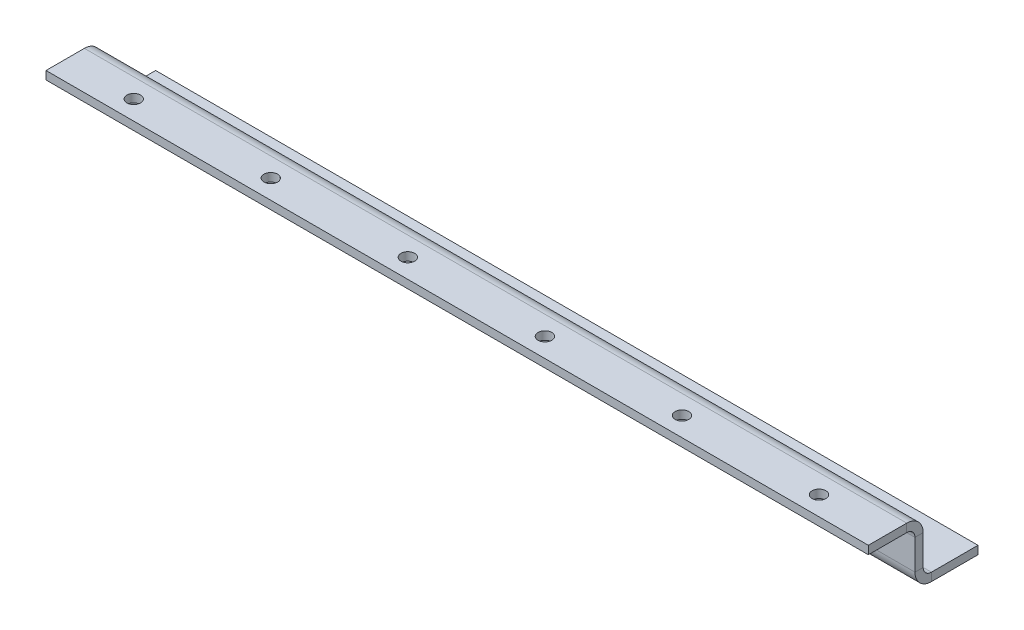
ISO-10303-21;
HEADER;
FILE_DESCRIPTION(('STEP AP214'),'2;1');
FILE_NAME('part.step','',(''),(''),'','','');
FILE_SCHEMA(('AUTOMOTIVE_DESIGN { 1 0 10303 214 1 1 1 1 }'));
ENDSEC;
DATA;
#1=APPLICATION_CONTEXT('core data for automotive mechanical design processes');
#2=APPLICATION_PROTOCOL_DEFINITION('international standard','automotive_design',2000,#1);
#3=PRODUCT_CONTEXT('',#1,'mechanical');
#4=PRODUCT('Part','Part','',(#3));
#5=PRODUCT_RELATED_PRODUCT_CATEGORY('part','',(#4));
#6=PRODUCT_DEFINITION_FORMATION('','',#4);
#7=PRODUCT_DEFINITION_CONTEXT('part definition',#1,'design');
#8=PRODUCT_DEFINITION('design','',#6,#7);
#9=PRODUCT_DEFINITION_SHAPE('','',#8);
#10=(LENGTH_UNIT() NAMED_UNIT(*) SI_UNIT(.MILLI.,.METRE.));
#11=(NAMED_UNIT(*) PLANE_ANGLE_UNIT() SI_UNIT($,.RADIAN.));
#12=(NAMED_UNIT(*) SI_UNIT($,.STERADIAN.) SOLID_ANGLE_UNIT());
#13=UNCERTAINTY_MEASURE_WITH_UNIT(LENGTH_MEASURE(1.E-05),#10,'distance_accuracy_value','');
#14=(GEOMETRIC_REPRESENTATION_CONTEXT(3) GLOBAL_UNCERTAINTY_ASSIGNED_CONTEXT((#13)) GLOBAL_UNIT_ASSIGNED_CONTEXT((#10,
#11,#12)) REPRESENTATION_CONTEXT('',''));
#15=CARTESIAN_POINT('',(0.,0.,0.));
#16=DIRECTION('',(0.,0.,1.));
#17=DIRECTION('',(1.,0.,0.));
#18=AXIS2_PLACEMENT_3D('',#15,#16,#17);
#19=CARTESIAN_POINT('',(300.,4.,0.));
#20=DIRECTION('',(1.,0.,0.));
#21=DIRECTION('',(0.,0.,-1.));
#22=AXIS2_PLACEMENT_3D('',#19,#20,#21);
#23=PLANE('',#22);
#24=DIRECTION('',(0.,0.,1.));
#25=VECTOR('',#24,1.);
#26=CARTESIAN_POINT('',(300.,4.,0.));
#27=LINE('',#26,#25);
#28=CARTESIAN_POINT('',(300.,4.,0.));
#29=VERTEX_POINT('',#28);
#30=CARTESIAN_POINT('',(300.,4.,3.));
#31=VERTEX_POINT('',#30);
#32=EDGE_CURVE('E11',#29,#31,#27,.T.);
#33=ORIENTED_EDGE('',*,*,#32,.F.);
#34=CARTESIAN_POINT('',(300.,4.,6.));
#35=DIRECTION('',(1.,0.,0.));
#36=DIRECTION('',(0.,0.,-1.));
#37=AXIS2_PLACEMENT_3D('',#34,#35,#36);
#38=CIRCLE('',#37,6.);
#39=CARTESIAN_POINT('',(300.,10.,6.));
#40=VERTEX_POINT('',#39);
#41=EDGE_CURVE('E248',#40,#29,#38,.F.);
#42=ORIENTED_EDGE('',*,*,#41,.F.);
#43=DIRECTION('',(0.,1.,0.));
#44=VECTOR('',#43,1.);
#45=CARTESIAN_POINT('',(300.,7.,6.));
#46=LINE('',#45,#44);
#47=CARTESIAN_POINT('',(300.,7.,6.));
#48=VERTEX_POINT('',#47);
#49=EDGE_CURVE('E45',#48,#40,#46,.T.);
#50=ORIENTED_EDGE('',*,*,#49,.F.);
#51=CARTESIAN_POINT('',(300.,4.,6.));
#52=DIRECTION('',(1.,0.,0.));
#53=DIRECTION('',(0.,0.,-1.));
#54=AXIS2_PLACEMENT_3D('',#51,#52,#53);
#55=CIRCLE('',#54,3.);
#56=EDGE_CURVE('E146',#48,#31,#55,.F.);
#57=ORIENTED_EDGE('',*,*,#56,.T.);
#58=EDGE_LOOP('',(#33,#42,#50,#57));
#59=FACE_BOUND('',#58,.T.);
#60=ADVANCED_FACE('F37',(#59),#23,.T.);
#61=CARTESIAN_POINT('',(300.,7.,6.));
#62=DIRECTION('',(1.,0.,0.));
#63=DIRECTION('',(0.,0.,-1.));
#64=AXIS2_PLACEMENT_3D('',#61,#62,#63);
#65=PLANE('',#64);
#66=DIRECTION('',(0.,-1.,0.));
#67=VECTOR('',#66,1.);
#68=CARTESIAN_POINT('',(300.,10.,0.));
#69=LINE('',#68,#67);
#70=CARTESIAN_POINT('',(300.,-7.,0.));
#71=VERTEX_POINT('',#70);
#72=EDGE_CURVE('E140',#29,#71,#69,.T.);
#73=ORIENTED_EDGE('',*,*,#72,.F.);
#74=ORIENTED_EDGE('',*,*,#32,.T.);
#75=DIRECTION('',(0.,1.,0.));
#76=VECTOR('',#75,1.);
#77=CARTESIAN_POINT('',(300.,10.,3.));
#78=LINE('',#77,#76);
#79=CARTESIAN_POINT('',(300.,-7.,3.));
#80=VERTEX_POINT('',#79);
#81=EDGE_CURVE('E137',#31,#80,#78,.F.);
#82=ORIENTED_EDGE('',*,*,#81,.T.);
#83=DIRECTION('',(0.,0.,-1.));
#84=VECTOR('',#83,1.);
#85=CARTESIAN_POINT('',(300.,-7.,3.));
#86=LINE('',#85,#84);
#87=EDGE_CURVE('E229',#80,#71,#86,.T.);
#88=ORIENTED_EDGE('',*,*,#87,.T.);
#89=EDGE_LOOP('',(#73,#74,#82,#88));
#90=FACE_BOUND('',#89,.T.);
#91=ADVANCED_FACE('F135',(#90),#65,.T.);
#92=CARTESIAN_POINT('',(0.,10.,6.));
#93=DIRECTION('',(-1.,0.,0.));
#94=DIRECTION('',(0.,0.,1.));
#95=AXIS2_PLACEMENT_3D('',#92,#93,#94);
#96=PLANE('',#95);
#97=DIRECTION('',(0.,-1.,0.));
#98=VECTOR('',#97,1.);
#99=CARTESIAN_POINT('',(0.,10.,6.));
#100=LINE('',#99,#98);
#101=CARTESIAN_POINT('',(0.,10.,6.));
#102=VERTEX_POINT('',#101);
#103=CARTESIAN_POINT('',(0.,7.,6.));
#104=VERTEX_POINT('',#103);
#105=EDGE_CURVE('E234',#102,#104,#100,.T.);
#106=ORIENTED_EDGE('',*,*,#105,.F.);
#107=CARTESIAN_POINT('',(0.,4.,6.));
#108=DIRECTION('',(1.,0.,0.));
#109=DIRECTION('',(0.,0.,-1.));
#110=AXIS2_PLACEMENT_3D('',#107,#108,#109);
#111=CIRCLE('',#110,6.);
#112=CARTESIAN_POINT('',(0.,4.,0.));
#113=VERTEX_POINT('',#112);
#114=EDGE_CURVE('E186',#102,#113,#111,.F.);
#115=ORIENTED_EDGE('',*,*,#114,.T.);
#116=DIRECTION('',(0.,0.,-1.));
#117=VECTOR('',#116,1.);
#118=CARTESIAN_POINT('',(0.,4.,3.));
#119=LINE('',#118,#117);
#120=CARTESIAN_POINT('',(0.,4.,3.));
#121=VERTEX_POINT('',#120);
#122=EDGE_CURVE('E232',#121,#113,#119,.T.);
#123=ORIENTED_EDGE('',*,*,#122,.F.);
#124=CARTESIAN_POINT('',(0.,4.,6.));
#125=DIRECTION('',(1.,0.,0.));
#126=DIRECTION('',(0.,0.,-1.));
#127=AXIS2_PLACEMENT_3D('',#124,#125,#126);
#128=CIRCLE('',#127,3.);
#129=EDGE_CURVE('E158',#104,#121,#128,.F.);
#130=ORIENTED_EDGE('',*,*,#129,.F.);
#131=EDGE_LOOP('',(#106,#115,#123,#130));
#132=FACE_BOUND('',#131,.T.);
#133=ADVANCED_FACE('F383',(#132),#96,.T.);
#134=CARTESIAN_POINT('',(0.,4.,3.));
#135=DIRECTION('',(-1.,0.,0.));
#136=DIRECTION('',(0.,0.,1.));
#137=AXIS2_PLACEMENT_3D('',#134,#135,#136);
#138=PLANE('',#137);
#139=DIRECTION('',(0.,0.,-1.));
#140=VECTOR('',#139,1.);
#141=CARTESIAN_POINT('',(0.,10.,20.));
#142=LINE('',#141,#140);
#143=CARTESIAN_POINT('',(0.,10.,20.));
#144=VERTEX_POINT('',#143);
#145=EDGE_CURVE('E189',#144,#102,#142,.T.);
#146=ORIENTED_EDGE('',*,*,#145,.T.);
#147=ORIENTED_EDGE('',*,*,#105,.T.);
#148=DIRECTION('',(0.,0.,-1.));
#149=VECTOR('',#148,1.);
#150=CARTESIAN_POINT('',(0.,7.,20.));
#151=LINE('',#150,#149);
#152=CARTESIAN_POINT('',(0.,7.,20.));
#153=VERTEX_POINT('',#152);
#154=EDGE_CURVE('E195',#153,#104,#151,.T.);
#155=ORIENTED_EDGE('',*,*,#154,.F.);
#156=DIRECTION('',(0.,1.,0.));
#157=VECTOR('',#156,1.);
#158=CARTESIAN_POINT('',(0.,7.,20.));
#159=LINE('',#158,#157);
#160=EDGE_CURVE('E192',#153,#144,#159,.T.);
#161=ORIENTED_EDGE('',*,*,#160,.T.);
#162=EDGE_LOOP('',(#146,#147,#155,#161));
#163=FACE_BOUND('',#162,.T.);
#164=ADVANCED_FACE('F386',(#163),#138,.T.);
#165=CARTESIAN_POINT('',(300.,-10.,-3.));
#166=DIRECTION('',(1.,0.,0.));
#167=DIRECTION('',(0.,0.,-1.));
#168=AXIS2_PLACEMENT_3D('',#165,#166,#167);
#169=PLANE('',#168);
#170=DIRECTION('',(0.,-1.,0.));
#171=VECTOR('',#170,1.);
#172=CARTESIAN_POINT('',(300.,-10.,-3.));
#173=LINE('',#172,#171);
#174=CARTESIAN_POINT('',(300.,-10.,-3.));
#175=VERTEX_POINT('',#174);
#176=CARTESIAN_POINT('',(300.,-13.,-3.));
#177=VERTEX_POINT('',#176);
#178=EDGE_CURVE('E53',#175,#177,#173,.T.);
#179=ORIENTED_EDGE('',*,*,#178,.F.);
#180=CARTESIAN_POINT('',(300.,-7.,-3.));
#181=DIRECTION('',(-1.,0.,0.));
#182=DIRECTION('',(0.,0.,1.));
#183=AXIS2_PLACEMENT_3D('',#180,#181,#182);
#184=CIRCLE('',#183,3.);
#185=EDGE_CURVE('E258',#71,#175,#184,.F.);
#186=ORIENTED_EDGE('',*,*,#185,.F.);
#187=ORIENTED_EDGE('',*,*,#87,.F.);
#188=CARTESIAN_POINT('',(300.,-7.,-3.));
#189=DIRECTION('',(1.,0.,0.));
#190=DIRECTION('',(0.,0.,-1.));
#191=AXIS2_PLACEMENT_3D('',#188,#189,#190);
#192=CIRCLE('',#191,6.);
#193=EDGE_CURVE('E166',#80,#177,#192,.T.);
#194=ORIENTED_EDGE('',*,*,#193,.T.);
#195=EDGE_LOOP('',(#179,#186,#187,#194));
#196=FACE_BOUND('',#195,.T.);
#197=ADVANCED_FACE('F378',(#196),#169,.T.);
#198=CARTESIAN_POINT('',(300.,-7.,3.));
#199=DIRECTION('',(1.,0.,0.));
#200=DIRECTION('',(0.,0.,-1.));
#201=AXIS2_PLACEMENT_3D('',#198,#199,#200);
#202=PLANE('',#201);
#203=DIRECTION('',(0.,0.,-1.));
#204=VECTOR('',#203,1.);
#205=CARTESIAN_POINT('',(300.,-10.,0.));
#206=LINE('',#205,#204);
#207=CARTESIAN_POINT('',(300.,-10.,-20.));
#208=VERTEX_POINT('',#207);
#209=EDGE_CURVE('E261',#175,#208,#206,.T.);
#210=ORIENTED_EDGE('',*,*,#209,.F.);
#211=ORIENTED_EDGE('',*,*,#178,.T.);
#212=DIRECTION('',(0.,0.,-1.));
#213=VECTOR('',#212,1.);
#214=CARTESIAN_POINT('',(300.,-13.,0.));
#215=LINE('',#214,#213);
#216=CARTESIAN_POINT('',(300.,-13.,-20.));
#217=VERTEX_POINT('',#216);
#218=EDGE_CURVE('E107',#177,#217,#215,.T.);
#219=ORIENTED_EDGE('',*,*,#218,.T.);
#220=DIRECTION('',(0.,-1.,0.));
#221=VECTOR('',#220,1.);
#222=CARTESIAN_POINT('',(300.,-10.,-20.));
#223=LINE('',#222,#221);
#224=EDGE_CURVE('E264',#208,#217,#223,.T.);
#225=ORIENTED_EDGE('',*,*,#224,.F.);
#226=EDGE_LOOP('',(#210,#211,#219,#225));
#227=FACE_BOUND('',#226,.T.);
#228=ADVANCED_FACE('F369',(#227),#202,.T.);
#229=CARTESIAN_POINT('',(0.,-7.,0.));
#230=DIRECTION('',(-1.,0.,0.));
#231=DIRECTION('',(0.,0.,1.));
#232=AXIS2_PLACEMENT_3D('',#229,#230,#231);
#233=PLANE('',#232);
#234=DIRECTION('',(0.,0.,1.));
#235=VECTOR('',#234,1.);
#236=CARTESIAN_POINT('',(0.,-7.,0.));
#237=LINE('',#236,#235);
#238=CARTESIAN_POINT('',(0.,-7.,0.));
#239=VERTEX_POINT('',#238);
#240=CARTESIAN_POINT('',(0.,-7.,3.));
#241=VERTEX_POINT('',#240);
#242=EDGE_CURVE('E94',#239,#241,#237,.T.);
#243=ORIENTED_EDGE('',*,*,#242,.F.);
#244=CARTESIAN_POINT('',(0.,-7.,-3.));
#245=DIRECTION('',(-1.,0.,0.));
#246=DIRECTION('',(0.,0.,1.));
#247=AXIS2_PLACEMENT_3D('',#244,#245,#246);
#248=CIRCLE('',#247,3.);
#249=CARTESIAN_POINT('',(0.,-10.,-3.));
#250=VERTEX_POINT('',#249);
#251=EDGE_CURVE('E182',#239,#250,#248,.F.);
#252=ORIENTED_EDGE('',*,*,#251,.T.);
#253=DIRECTION('',(0.,1.,0.));
#254=VECTOR('',#253,1.);
#255=CARTESIAN_POINT('',(0.,-13.,-3.));
#256=LINE('',#255,#254);
#257=CARTESIAN_POINT('',(0.,-13.,-3.));
#258=VERTEX_POINT('',#257);
#259=EDGE_CURVE('E101',#258,#250,#256,.T.);
#260=ORIENTED_EDGE('',*,*,#259,.F.);
#261=CARTESIAN_POINT('',(0.,-7.,-3.));
#262=DIRECTION('',(1.,0.,0.));
#263=DIRECTION('',(0.,0.,-1.));
#264=AXIS2_PLACEMENT_3D('',#261,#262,#263);
#265=CIRCLE('',#264,6.);
#266=EDGE_CURVE('E201',#241,#258,#265,.T.);
#267=ORIENTED_EDGE('',*,*,#266,.F.);
#268=EDGE_LOOP('',(#243,#252,#260,#267));
#269=FACE_BOUND('',#268,.T.);
#270=ADVANCED_FACE('F417',(#269),#233,.T.);
#271=CARTESIAN_POINT('',(0.,-13.,-3.));
#272=DIRECTION('',(-1.,0.,0.));
#273=DIRECTION('',(0.,0.,1.));
#274=AXIS2_PLACEMENT_3D('',#271,#272,#273);
#275=PLANE('',#274);
#276=DIRECTION('',(0.,-1.,0.));
#277=VECTOR('',#276,1.);
#278=CARTESIAN_POINT('',(0.,10.,0.));
#279=LINE('',#278,#277);
#280=EDGE_CURVE('E184',#113,#239,#279,.T.);
#281=ORIENTED_EDGE('',*,*,#280,.T.);
#282=ORIENTED_EDGE('',*,*,#242,.T.);
#283=DIRECTION('',(0.,1.,0.));
#284=VECTOR('',#283,1.);
#285=CARTESIAN_POINT('',(0.,10.,3.));
#286=LINE('',#285,#284);
#287=EDGE_CURVE('E199',#121,#241,#286,.F.);
#288=ORIENTED_EDGE('',*,*,#287,.F.);
#289=ORIENTED_EDGE('',*,*,#122,.T.);
#290=EDGE_LOOP('',(#281,#282,#288,#289));
#291=FACE_BOUND('',#290,.T.);
#292=ADVANCED_FACE('F355',(#291),#275,.T.);
#293=CARTESIAN_POINT('',(300.,-13.,0.));
#294=DIRECTION('',(0.,1.,0.));
#295=DIRECTION('',(0.,0.,1.));
#296=AXIS2_PLACEMENT_3D('',#293,#294,#295);
#297=PLANE('',#296);
#298=CARTESIAN_POINT('',(74.9999999999999,-13.,-11.5));
#299=DIRECTION('',(0.,1.,0.));
#300=DIRECTION('',(0.,0.,1.));
#301=AXIS2_PLACEMENT_3D('',#298,#299,#300);
#302=CIRCLE('',#301,2.5);
#303=CARTESIAN_POINT('',(74.9999999999999,-13.,-9.00000000000001));
#304=VERTEX_POINT('',#303);
#305=EDGE_CURVE('E298',#304,#304,#302,.F.);
#306=ORIENTED_EDGE('',*,*,#305,.F.);
#307=EDGE_LOOP('',(#306));
#308=FACE_BOUND('',#307,.T.);
#309=CARTESIAN_POINT('',(125.,-13.,-11.5));
#310=DIRECTION('',(0.,1.,0.));
#311=DIRECTION('',(0.,0.,1.));
#312=AXIS2_PLACEMENT_3D('',#309,#310,#311);
#313=CIRCLE('',#312,2.5);
#314=CARTESIAN_POINT('',(125.,-13.,-9.00000000000001));
#315=VERTEX_POINT('',#314);
#316=EDGE_CURVE('E305',#315,#315,#313,.F.);
#317=ORIENTED_EDGE('',*,*,#316,.F.);
#318=EDGE_LOOP('',(#317));
#319=FACE_BOUND('',#318,.T.);
#320=CARTESIAN_POINT('',(175.,-13.,-11.5));
#321=DIRECTION('',(0.,1.,0.));
#322=DIRECTION('',(0.,0.,1.));
#323=AXIS2_PLACEMENT_3D('',#320,#321,#322);
#324=CIRCLE('',#323,2.50000000000002);
#325=CARTESIAN_POINT('',(175.,-13.,-8.99999999999998));
#326=VERTEX_POINT('',#325);
#327=EDGE_CURVE('E310',#326,#326,#324,.F.);
#328=ORIENTED_EDGE('',*,*,#327,.F.);
#329=EDGE_LOOP('',(#328));
#330=FACE_BOUND('',#329,.T.);
#331=CARTESIAN_POINT('',(225.,-13.,-11.5));
#332=DIRECTION('',(0.,1.,0.));
#333=DIRECTION('',(0.,0.,1.));
#334=AXIS2_PLACEMENT_3D('',#331,#332,#333);
#335=CIRCLE('',#334,2.50000000000002);
#336=CARTESIAN_POINT('',(225.,-13.,-8.99999999999998));
#337=VERTEX_POINT('',#336);
#338=EDGE_CURVE('E317',#337,#337,#335,.F.);
#339=ORIENTED_EDGE('',*,*,#338,.F.);
#340=EDGE_LOOP('',(#339));
#341=FACE_BOUND('',#340,.T.);
#342=CARTESIAN_POINT('',(275.,-13.,-11.5));
#343=DIRECTION('',(0.,1.,0.));
#344=DIRECTION('',(0.,0.,1.));
#345=AXIS2_PLACEMENT_3D('',#342,#343,#344);
#346=CIRCLE('',#345,2.50000000000002);
#347=CARTESIAN_POINT('',(275.,-13.,-8.99999999999998));
#348=VERTEX_POINT('',#347);
#349=EDGE_CURVE('E329',#348,#348,#346,.F.);
#350=ORIENTED_EDGE('',*,*,#349,.F.);
#351=EDGE_LOOP('',(#350));
#352=FACE_BOUND('',#351,.T.);
#353=CARTESIAN_POINT('',(24.9999999999999,-13.,-11.5));
#354=DIRECTION('',(0.,1.,0.));
#355=DIRECTION('',(0.,0.,1.));
#356=AXIS2_PLACEMENT_3D('',#353,#354,#355);
#357=CIRCLE('',#356,2.5);
#358=CARTESIAN_POINT('',(24.9999999999999,-13.,-9.00000000000001));
#359=VERTEX_POINT('',#358);
#360=EDGE_CURVE('E322',#359,#359,#357,.F.);
#361=ORIENTED_EDGE('',*,*,#360,.F.);
#362=EDGE_LOOP('',(#361));
#363=FACE_BOUND('',#362,.T.);
#364=DIRECTION('',(0.,0.,-1.));
#365=VECTOR('',#364,1.);
#366=CARTESIAN_POINT('',(0.,-13.,0.));
#367=LINE('',#366,#365);
#368=CARTESIAN_POINT('',(0.,-13.,-20.));
#369=VERTEX_POINT('',#368);
#370=EDGE_CURVE('E172',#258,#369,#367,.T.);
#371=ORIENTED_EDGE('',*,*,#370,.T.);
#372=DIRECTION('',(-1.,0.,0.));
#373=VECTOR('',#372,1.);
#374=CARTESIAN_POINT('',(300.,-13.,-20.));
#375=LINE('',#374,#373);
#376=EDGE_CURVE('E225',#217,#369,#375,.T.);
#377=ORIENTED_EDGE('',*,*,#376,.F.);
#378=ORIENTED_EDGE('',*,*,#218,.F.);
#379=DIRECTION('',(-1.,0.,0.));
#380=VECTOR('',#379,1.);
#381=CARTESIAN_POINT('',(300.,-13.,-3.));
#382=LINE('',#381,#380);
#383=EDGE_CURVE('E168',#177,#258,#382,.T.);
#384=ORIENTED_EDGE('',*,*,#383,.T.);
#385=EDGE_LOOP('',(#371,#377,#378,#384));
#386=FACE_BOUND('',#385,.T.);
#387=ADVANCED_FACE('F351',(#308,#319,#330,#341,#352,#363,#386),#297,.F.);
#388=CARTESIAN_POINT('',(300.,-10.,-20.));
#389=DIRECTION('',(0.,0.,-1.));
#390=DIRECTION('',(-1.,0.,0.));
#391=AXIS2_PLACEMENT_3D('',#388,#389,#390);
#392=PLANE('',#391);
#393=DIRECTION('',(0.,-1.,0.));
#394=VECTOR('',#393,1.);
#395=CARTESIAN_POINT('',(0.,-10.,-20.));
#396=LINE('',#395,#394);
#397=CARTESIAN_POINT('',(0.,-10.,-20.));
#398=VERTEX_POINT('',#397);
#399=EDGE_CURVE('E175',#398,#369,#396,.T.);
#400=ORIENTED_EDGE('',*,*,#399,.F.);
#401=DIRECTION('',(-1.,0.,0.));
#402=VECTOR('',#401,1.);
#403=CARTESIAN_POINT('',(300.,-10.,-20.));
#404=LINE('',#403,#402);
#405=EDGE_CURVE('E223',#208,#398,#404,.T.);
#406=ORIENTED_EDGE('',*,*,#405,.F.);
#407=ORIENTED_EDGE('',*,*,#224,.T.);
#408=ORIENTED_EDGE('',*,*,#376,.T.);
#409=EDGE_LOOP('',(#400,#406,#407,#408));
#410=FACE_BOUND('',#409,.T.);
#411=ADVANCED_FACE('F354',(#410),#392,.T.);
#412=CARTESIAN_POINT('',(300.,-10.,0.));
#413=DIRECTION('',(0.,1.,0.));
#414=DIRECTION('',(0.,0.,1.));
#415=AXIS2_PLACEMENT_3D('',#412,#413,#414);
#416=PLANE('',#415);
#417=CARTESIAN_POINT('',(74.9999999999999,-10.,-11.5));
#418=DIRECTION('',(0.,1.,0.));
#419=DIRECTION('',(0.,0.,1.));
#420=AXIS2_PLACEMENT_3D('',#417,#418,#419);
#421=CIRCLE('',#420,2.5);
#422=CARTESIAN_POINT('',(74.9999999999999,-10.,-9.00000000000001));
#423=VERTEX_POINT('',#422);
#424=EDGE_CURVE('E302',#423,#423,#421,.F.);
#425=ORIENTED_EDGE('',*,*,#424,.T.);
#426=EDGE_LOOP('',(#425));
#427=FACE_BOUND('',#426,.T.);
#428=CARTESIAN_POINT('',(125.,-10.,-11.5));
#429=DIRECTION('',(0.,1.,0.));
#430=DIRECTION('',(0.,0.,1.));
#431=AXIS2_PLACEMENT_3D('',#428,#429,#430);
#432=CIRCLE('',#431,2.5);
#433=CARTESIAN_POINT('',(125.,-10.,-9.00000000000001));
#434=VERTEX_POINT('',#433);
#435=EDGE_CURVE('E313',#434,#434,#432,.F.);
#436=ORIENTED_EDGE('',*,*,#435,.T.);
#437=EDGE_LOOP('',(#436));
#438=FACE_BOUND('',#437,.T.);
#439=CARTESIAN_POINT('',(175.,-10.,-11.5));
#440=DIRECTION('',(0.,1.,0.));
#441=DIRECTION('',(0.,0.,1.));
#442=AXIS2_PLACEMENT_3D('',#439,#440,#441);
#443=CIRCLE('',#442,2.50000000000002);
#444=CARTESIAN_POINT('',(175.,-10.,-8.99999999999998));
#445=VERTEX_POINT('',#444);
#446=EDGE_CURVE('E314',#445,#445,#443,.F.);
#447=ORIENTED_EDGE('',*,*,#446,.T.);
#448=EDGE_LOOP('',(#447));
#449=FACE_BOUND('',#448,.T.);
#450=CARTESIAN_POINT('',(225.,-10.,-11.5));
#451=DIRECTION('',(0.,1.,0.));
#452=DIRECTION('',(0.,0.,1.));
#453=AXIS2_PLACEMENT_3D('',#450,#451,#452);
#454=CIRCLE('',#453,2.50000000000002);
#455=CARTESIAN_POINT('',(225.,-10.,-8.99999999999998));
#456=VERTEX_POINT('',#455);
#457=EDGE_CURVE('E332',#456,#456,#454,.F.);
#458=ORIENTED_EDGE('',*,*,#457,.T.);
#459=EDGE_LOOP('',(#458));
#460=FACE_BOUND('',#459,.T.);
#461=CARTESIAN_POINT('',(275.,-10.,-11.5));
#462=DIRECTION('',(0.,1.,0.));
#463=DIRECTION('',(0.,0.,1.));
#464=AXIS2_PLACEMENT_3D('',#461,#462,#463);
#465=CIRCLE('',#464,2.50000000000002);
#466=CARTESIAN_POINT('',(275.,-10.,-8.99999999999998));
#467=VERTEX_POINT('',#466);
#468=EDGE_CURVE('E325',#467,#467,#465,.F.);
#469=ORIENTED_EDGE('',*,*,#468,.T.);
#470=EDGE_LOOP('',(#469));
#471=FACE_BOUND('',#470,.T.);
#472=CARTESIAN_POINT('',(24.9999999999999,-10.,-11.5));
#473=DIRECTION('',(0.,1.,0.));
#474=DIRECTION('',(0.,0.,1.));
#475=AXIS2_PLACEMENT_3D('',#472,#473,#474);
#476=CIRCLE('',#475,2.5);
#477=CARTESIAN_POINT('',(24.9999999999999,-10.,-9.00000000000001));
#478=VERTEX_POINT('',#477);
#479=EDGE_CURVE('E326',#478,#478,#476,.F.);
#480=ORIENTED_EDGE('',*,*,#479,.T.);
#481=EDGE_LOOP('',(#480));
#482=FACE_BOUND('',#481,.T.);
#483=DIRECTION('',(0.,0.,-1.));
#484=VECTOR('',#483,1.);
#485=CARTESIAN_POINT('',(0.,-10.,0.));
#486=LINE('',#485,#484);
#487=EDGE_CURVE('E179',#250,#398,#486,.T.);
#488=ORIENTED_EDGE('',*,*,#487,.F.);
#489=DIRECTION('',(-1.,0.,0.));
#490=VECTOR('',#489,1.);
#491=CARTESIAN_POINT('',(300.,-10.,-3.));
#492=LINE('',#491,#490);
#493=EDGE_CURVE('E220',#175,#250,#492,.T.);
#494=ORIENTED_EDGE('',*,*,#493,.F.);
#495=ORIENTED_EDGE('',*,*,#209,.T.);
#496=ORIENTED_EDGE('',*,*,#405,.T.);
#497=EDGE_LOOP('',(#488,#494,#495,#496));
#498=FACE_BOUND('',#497,.T.);
#499=ADVANCED_FACE('F340',(#427,#438,#449,#460,#471,#482,#498),#416,.T.);
#500=CARTESIAN_POINT('',(300.,-7.,-3.));
#501=DIRECTION('',(-1.,0.,0.));
#502=DIRECTION('',(0.,0.,1.));
#503=AXIS2_PLACEMENT_3D('',#500,#501,#502);
#504=CYLINDRICAL_SURFACE('',#503,3.);
#505=ORIENTED_EDGE('',*,*,#251,.F.);
#506=DIRECTION('',(-1.,0.,0.));
#507=VECTOR('',#506,1.);
#508=CARTESIAN_POINT('',(300.,-7.,0.));
#509=LINE('',#508,#507);
#510=EDGE_CURVE('E217',#71,#239,#509,.T.);
#511=ORIENTED_EDGE('',*,*,#510,.F.);
#512=ORIENTED_EDGE('',*,*,#185,.T.);
#513=ORIENTED_EDGE('',*,*,#493,.T.);
#514=EDGE_LOOP('',(#505,#511,#512,#513));
#515=FACE_BOUND('',#514,.T.);
#516=ADVANCED_FACE('F374',(#515),#504,.F.);
#517=CARTESIAN_POINT('',(300.,10.,0.));
#518=DIRECTION('',(0.,0.,-1.));
#519=DIRECTION('',(-1.,0.,0.));
#520=AXIS2_PLACEMENT_3D('',#517,#518,#519);
#521=PLANE('',#520);
#522=ORIENTED_EDGE('',*,*,#280,.F.);
#523=DIRECTION('',(-1.,0.,0.));
#524=VECTOR('',#523,1.);
#525=CARTESIAN_POINT('',(300.,4.,0.));
#526=LINE('',#525,#524);
#527=EDGE_CURVE('E214',#29,#113,#526,.T.);
#528=ORIENTED_EDGE('',*,*,#527,.F.);
#529=ORIENTED_EDGE('',*,*,#72,.T.);
#530=ORIENTED_EDGE('',*,*,#510,.T.);
#531=EDGE_LOOP('',(#522,#528,#529,#530));
#532=FACE_BOUND('',#531,.T.);
#533=ADVANCED_FACE('F381',(#532),#521,.T.);
#534=CARTESIAN_POINT('',(300.,4.,6.));
#535=DIRECTION('',(-1.,0.,0.));
#536=DIRECTION('',(0.,0.,1.));
#537=AXIS2_PLACEMENT_3D('',#534,#535,#536);
#538=CYLINDRICAL_SURFACE('',#537,6.);
#539=ORIENTED_EDGE('',*,*,#114,.F.);
#540=DIRECTION('',(-1.,0.,0.));
#541=VECTOR('',#540,1.);
#542=CARTESIAN_POINT('',(300.,10.,6.));
#543=LINE('',#542,#541);
#544=EDGE_CURVE('E211',#40,#102,#543,.T.);
#545=ORIENTED_EDGE('',*,*,#544,.F.);
#546=ORIENTED_EDGE('',*,*,#41,.T.);
#547=ORIENTED_EDGE('',*,*,#527,.T.);
#548=EDGE_LOOP('',(#539,#545,#546,#547));
#549=FACE_BOUND('',#548,.T.);
#550=ADVANCED_FACE('F247',(#549),#538,.T.);
#551=CARTESIAN_POINT('',(300.,10.,20.));
#552=DIRECTION('',(0.,1.,0.));
#553=DIRECTION('',(0.,0.,1.));
#554=AXIS2_PLACEMENT_3D('',#551,#552,#553);
#555=PLANE('',#554);
#556=CARTESIAN_POINT('',(275.,10.,13.));
#557=DIRECTION('',(0.,1.,0.));
#558=DIRECTION('',(0.,0.,1.));
#559=AXIS2_PLACEMENT_3D('',#556,#557,#558);
#560=CIRCLE('',#559,2.49999999999996);
#561=CARTESIAN_POINT('',(275.,10.,15.5));
#562=VERTEX_POINT('',#561);
#563=EDGE_CURVE('E301',#562,#562,#560,.T.);
#564=ORIENTED_EDGE('',*,*,#563,.F.);
#565=EDGE_LOOP('',(#564));
#566=FACE_BOUND('',#565,.T.);
#567=CARTESIAN_POINT('',(225.,10.,13.));
#568=DIRECTION('',(0.,1.,0.));
#569=DIRECTION('',(0.,0.,1.));
#570=AXIS2_PLACEMENT_3D('',#567,#568,#569);
#571=CIRCLE('',#570,2.5);
#572=CARTESIAN_POINT('',(225.,10.,15.5));
#573=VERTEX_POINT('',#572);
#574=EDGE_CURVE('E278',#573,#573,#571,.T.);
#575=ORIENTED_EDGE('',*,*,#574,.F.);
#576=EDGE_LOOP('',(#575));
#577=FACE_BOUND('',#576,.T.);
#578=CARTESIAN_POINT('',(175.,10.,13.));
#579=DIRECTION('',(0.,1.,0.));
#580=DIRECTION('',(0.,0.,1.));
#581=AXIS2_PLACEMENT_3D('',#578,#579,#580);
#582=CIRCLE('',#581,2.5);
#583=CARTESIAN_POINT('',(175.,10.,15.5));
#584=VERTEX_POINT('',#583);
#585=EDGE_CURVE('E277',#584,#584,#582,.T.);
#586=ORIENTED_EDGE('',*,*,#585,.F.);
#587=EDGE_LOOP('',(#586));
#588=FACE_BOUND('',#587,.T.);
#589=CARTESIAN_POINT('',(125.,10.,13.));
#590=DIRECTION('',(0.,1.,0.));
#591=DIRECTION('',(0.,0.,1.));
#592=AXIS2_PLACEMENT_3D('',#589,#590,#591);
#593=CIRCLE('',#592,2.5);
#594=CARTESIAN_POINT('',(125.,10.,15.5));
#595=VERTEX_POINT('',#594);
#596=EDGE_CURVE('E285',#595,#595,#593,.T.);
#597=ORIENTED_EDGE('',*,*,#596,.F.);
#598=EDGE_LOOP('',(#597));
#599=FACE_BOUND('',#598,.T.);
#600=CARTESIAN_POINT('',(75.,10.,13.));
#601=DIRECTION('',(0.,1.,0.));
#602=DIRECTION('',(0.,0.,1.));
#603=AXIS2_PLACEMENT_3D('',#600,#601,#602);
#604=CIRCLE('',#603,2.5);
#605=CARTESIAN_POINT('',(75.,10.,15.5));
#606=VERTEX_POINT('',#605);
#607=EDGE_CURVE('E291',#606,#606,#604,.T.);
#608=ORIENTED_EDGE('',*,*,#607,.F.);
#609=EDGE_LOOP('',(#608));
#610=FACE_BOUND('',#609,.T.);
#611=CARTESIAN_POINT('',(25.,10.,13.));
#612=DIRECTION('',(0.,1.,0.));
#613=DIRECTION('',(0.,0.,1.));
#614=AXIS2_PLACEMENT_3D('',#611,#612,#613);
#615=CIRCLE('',#614,2.5);
#616=CARTESIAN_POINT('',(25.,10.,15.5));
#617=VERTEX_POINT('',#616);
#618=EDGE_CURVE('E270',#617,#617,#615,.T.);
#619=ORIENTED_EDGE('',*,*,#618,.F.);
#620=EDGE_LOOP('',(#619));
#621=FACE_BOUND('',#620,.T.);
#622=ORIENTED_EDGE('',*,*,#145,.F.);
#623=DIRECTION('',(-1.,0.,0.));
#624=VECTOR('',#623,1.);
#625=CARTESIAN_POINT('',(300.,10.,20.));
#626=LINE('',#625,#624);
#627=CARTESIAN_POINT('',(300.,10.,20.));
#628=VERTEX_POINT('',#627);
#629=EDGE_CURVE('E209',#628,#144,#626,.T.);
#630=ORIENTED_EDGE('',*,*,#629,.F.);
#631=DIRECTION('',(0.,0.,-1.));
#632=VECTOR('',#631,1.);
#633=CARTESIAN_POINT('',(300.,10.,20.));
#634=LINE('',#633,#632);
#635=EDGE_CURVE('E241',#628,#40,#634,.T.);
#636=ORIENTED_EDGE('',*,*,#635,.T.);
#637=ORIENTED_EDGE('',*,*,#544,.T.);
#638=EDGE_LOOP('',(#622,#630,#636,#637));
#639=FACE_BOUND('',#638,.T.);
#640=ADVANCED_FACE('F252',(#566,#577,#588,#599,#610,#621,#639),#555,.T.);
#641=CARTESIAN_POINT('',(300.,7.,20.));
#642=DIRECTION('',(0.,0.,1.));
#643=DIRECTION('',(1.,0.,0.));
#644=AXIS2_PLACEMENT_3D('',#641,#642,#643);
#645=PLANE('',#644);
#646=ORIENTED_EDGE('',*,*,#160,.F.);
#647=DIRECTION('',(-1.,0.,0.));
#648=VECTOR('',#647,1.);
#649=CARTESIAN_POINT('',(300.,7.,20.));
#650=LINE('',#649,#648);
#651=CARTESIAN_POINT('',(300.,7.,20.));
#652=VERTEX_POINT('',#651);
#653=EDGE_CURVE('E207',#652,#153,#650,.T.);
#654=ORIENTED_EDGE('',*,*,#653,.F.);
#655=DIRECTION('',(0.,1.,0.));
#656=VECTOR('',#655,1.);
#657=CARTESIAN_POINT('',(300.,7.,20.));
#658=LINE('',#657,#656);
#659=EDGE_CURVE('E253',#652,#628,#658,.T.);
#660=ORIENTED_EDGE('',*,*,#659,.T.);
#661=ORIENTED_EDGE('',*,*,#629,.T.);
#662=EDGE_LOOP('',(#646,#654,#660,#661));
#663=FACE_BOUND('',#662,.T.);
#664=ADVANCED_FACE('F391',(#663),#645,.T.);
#665=CARTESIAN_POINT('',(300.,7.,20.));
#666=DIRECTION('',(0.,1.,0.));
#667=DIRECTION('',(0.,0.,1.));
#668=AXIS2_PLACEMENT_3D('',#665,#666,#667);
#669=PLANE('',#668);
#670=CARTESIAN_POINT('',(275.,7.,13.));
#671=DIRECTION('',(0.,1.,0.));
#672=DIRECTION('',(0.,0.,1.));
#673=AXIS2_PLACEMENT_3D('',#670,#671,#672);
#674=CIRCLE('',#673,2.49999999999996);
#675=CARTESIAN_POINT('',(275.,7.,15.5));
#676=VERTEX_POINT('',#675);
#677=EDGE_CURVE('E281',#676,#676,#674,.F.);
#678=ORIENTED_EDGE('',*,*,#677,.F.);
#679=EDGE_LOOP('',(#678));
#680=FACE_BOUND('',#679,.T.);
#681=CARTESIAN_POINT('',(225.,7.,13.));
#682=DIRECTION('',(0.,1.,0.));
#683=DIRECTION('',(0.,0.,1.));
#684=AXIS2_PLACEMENT_3D('',#681,#682,#683);
#685=CIRCLE('',#684,2.5);
#686=CARTESIAN_POINT('',(225.,7.,15.5));
#687=VERTEX_POINT('',#686);
#688=EDGE_CURVE('E274',#687,#687,#685,.F.);
#689=ORIENTED_EDGE('',*,*,#688,.F.);
#690=EDGE_LOOP('',(#689));
#691=FACE_BOUND('',#690,.T.);
#692=CARTESIAN_POINT('',(175.,7.,13.));
#693=DIRECTION('',(0.,1.,0.));
#694=DIRECTION('',(0.,0.,1.));
#695=AXIS2_PLACEMENT_3D('',#692,#693,#694);
#696=CIRCLE('',#695,2.5);
#697=CARTESIAN_POINT('',(175.,7.,15.5));
#698=VERTEX_POINT('',#697);
#699=EDGE_CURVE('E282',#698,#698,#696,.F.);
#700=ORIENTED_EDGE('',*,*,#699,.F.);
#701=EDGE_LOOP('',(#700));
#702=FACE_BOUND('',#701,.T.);
#703=CARTESIAN_POINT('',(125.,7.,13.));
#704=DIRECTION('',(0.,1.,0.));
#705=DIRECTION('',(0.,0.,1.));
#706=AXIS2_PLACEMENT_3D('',#703,#704,#705);
#707=CIRCLE('',#706,2.5);
#708=CARTESIAN_POINT('',(125.,7.,15.5));
#709=VERTEX_POINT('',#708);
#710=EDGE_CURVE('E288',#709,#709,#707,.F.);
#711=ORIENTED_EDGE('',*,*,#710,.F.);
#712=EDGE_LOOP('',(#711));
#713=FACE_BOUND('',#712,.T.);
#714=CARTESIAN_POINT('',(75.,7.,13.));
#715=DIRECTION('',(0.,1.,0.));
#716=DIRECTION('',(0.,0.,1.));
#717=AXIS2_PLACEMENT_3D('',#714,#715,#716);
#718=CIRCLE('',#717,2.5);
#719=CARTESIAN_POINT('',(75.,7.,15.5));
#720=VERTEX_POINT('',#719);
#721=EDGE_CURVE('E273',#720,#720,#718,.F.);
#722=ORIENTED_EDGE('',*,*,#721,.F.);
#723=EDGE_LOOP('',(#722));
#724=FACE_BOUND('',#723,.T.);
#725=CARTESIAN_POINT('',(25.,7.,13.));
#726=DIRECTION('',(0.,1.,0.));
#727=DIRECTION('',(0.,0.,1.));
#728=AXIS2_PLACEMENT_3D('',#725,#726,#727);
#729=CIRCLE('',#728,2.5);
#730=CARTESIAN_POINT('',(25.,7.,15.5));
#731=VERTEX_POINT('',#730);
#732=EDGE_CURVE('E176',#731,#731,#729,.F.);
#733=ORIENTED_EDGE('',*,*,#732,.F.);
#734=EDGE_LOOP('',(#733));
#735=FACE_BOUND('',#734,.T.);
#736=ORIENTED_EDGE('',*,*,#154,.T.);
#737=DIRECTION('',(-1.,0.,0.));
#738=VECTOR('',#737,1.);
#739=CARTESIAN_POINT('',(300.,7.,6.));
#740=LINE('',#739,#738);
#741=EDGE_CURVE('E160',#48,#104,#740,.T.);
#742=ORIENTED_EDGE('',*,*,#741,.F.);
#743=DIRECTION('',(0.,0.,-1.));
#744=VECTOR('',#743,1.);
#745=CARTESIAN_POINT('',(300.,7.,20.));
#746=LINE('',#745,#744);
#747=EDGE_CURVE('E151',#652,#48,#746,.T.);
#748=ORIENTED_EDGE('',*,*,#747,.F.);
#749=ORIENTED_EDGE('',*,*,#653,.T.);
#750=EDGE_LOOP('',(#736,#742,#748,#749));
#751=FACE_BOUND('',#750,.T.);
#752=ADVANCED_FACE('F389',(#680,#691,#702,#713,#724,#735,#751),#669,.F.);
#753=CARTESIAN_POINT('',(300.,4.,6.));
#754=DIRECTION('',(-1.,0.,0.));
#755=DIRECTION('',(0.,0.,1.));
#756=AXIS2_PLACEMENT_3D('',#753,#754,#755);
#757=CYLINDRICAL_SURFACE('',#756,3.);
#758=ORIENTED_EDGE('',*,*,#129,.T.);
#759=DIRECTION('',(-1.,0.,0.));
#760=VECTOR('',#759,1.);
#761=CARTESIAN_POINT('',(300.,4.,3.));
#762=LINE('',#761,#760);
#763=EDGE_CURVE('E155',#31,#121,#762,.T.);
#764=ORIENTED_EDGE('',*,*,#763,.F.);
#765=ORIENTED_EDGE('',*,*,#56,.F.);
#766=ORIENTED_EDGE('',*,*,#741,.T.);
#767=EDGE_LOOP('',(#758,#764,#765,#766));
#768=FACE_BOUND('',#767,.T.);
#769=ADVANCED_FACE('F156',(#768),#757,.F.);
#770=CARTESIAN_POINT('',(300.,10.,3.));
#771=DIRECTION('',(0.,0.,-1.));
#772=DIRECTION('',(-1.,0.,0.));
#773=AXIS2_PLACEMENT_3D('',#770,#771,#772);
#774=PLANE('',#773);
#775=ORIENTED_EDGE('',*,*,#287,.T.);
#776=DIRECTION('',(-1.,0.,0.));
#777=VECTOR('',#776,1.);
#778=CARTESIAN_POINT('',(300.,-7.,3.));
#779=LINE('',#778,#777);
#780=EDGE_CURVE('E161',#80,#241,#779,.T.);
#781=ORIENTED_EDGE('',*,*,#780,.F.);
#782=ORIENTED_EDGE('',*,*,#81,.F.);
#783=ORIENTED_EDGE('',*,*,#763,.T.);
#784=EDGE_LOOP('',(#775,#781,#782,#783));
#785=FACE_BOUND('',#784,.T.);
#786=ADVANCED_FACE('F163',(#785),#774,.F.);
#787=CARTESIAN_POINT('',(300.,-7.,-3.));
#788=DIRECTION('',(-1.,0.,0.));
#789=DIRECTION('',(0.,0.,1.));
#790=AXIS2_PLACEMENT_3D('',#787,#788,#789);
#791=CYLINDRICAL_SURFACE('',#790,6.);
#792=ORIENTED_EDGE('',*,*,#266,.T.);
#793=ORIENTED_EDGE('',*,*,#383,.F.);
#794=ORIENTED_EDGE('',*,*,#193,.F.);
#795=ORIENTED_EDGE('',*,*,#780,.T.);
#796=EDGE_LOOP('',(#792,#793,#794,#795));
#797=FACE_BOUND('',#796,.T.);
#798=ADVANCED_FACE('F639',(#797),#791,.T.);
#799=CARTESIAN_POINT('',(300.,-7.,-3.));
#800=DIRECTION('',(-1.,0.,0.));
#801=DIRECTION('',(0.,0.,1.));
#802=AXIS2_PLACEMENT_3D('',#799,#800,#801);
#803=PLANE('',#802);
#804=ORIENTED_EDGE('',*,*,#747,.T.);
#805=ORIENTED_EDGE('',*,*,#49,.T.);
#806=ORIENTED_EDGE('',*,*,#635,.F.);
#807=ORIENTED_EDGE('',*,*,#659,.F.);
#808=EDGE_LOOP('',(#804,#805,#806,#807));
#809=FACE_BOUND('',#808,.T.);
#810=ADVANCED_FACE('F238',(#809),#803,.F.);
#811=CARTESIAN_POINT('',(0.,-7.,-3.));
#812=DIRECTION('',(-1.,0.,0.));
#813=DIRECTION('',(0.,0.,1.));
#814=AXIS2_PLACEMENT_3D('',#811,#812,#813);
#815=PLANE('',#814);
#816=ORIENTED_EDGE('',*,*,#370,.F.);
#817=ORIENTED_EDGE('',*,*,#259,.T.);
#818=ORIENTED_EDGE('',*,*,#487,.T.);
#819=ORIENTED_EDGE('',*,*,#399,.T.);
#820=EDGE_LOOP('',(#816,#817,#818,#819));
#821=FACE_BOUND('',#820,.T.);
#822=ADVANCED_FACE('F366',(#821),#815,.T.);
#823=CARTESIAN_POINT('',(25.,-13.001,13.));
#824=DIRECTION('',(0.,1.,0.));
#825=DIRECTION('',(0.,0.,1.));
#826=AXIS2_PLACEMENT_3D('',#823,#824,#825);
#827=CYLINDRICAL_SURFACE('',#826,2.5);
#828=ORIENTED_EDGE('',*,*,#618,.T.);
#829=EDGE_LOOP('',(#828));
#830=FACE_BOUND('',#829,.T.);
#831=ORIENTED_EDGE('',*,*,#732,.T.);
#832=EDGE_LOOP('',(#831));
#833=FACE_BOUND('',#832,.T.);
#834=ADVANCED_FACE('F460',(#830,#833),#827,.F.);
#835=CARTESIAN_POINT('',(75.,-13.001,13.));
#836=DIRECTION('',(0.,1.,0.));
#837=DIRECTION('',(0.,0.,1.));
#838=AXIS2_PLACEMENT_3D('',#835,#836,#837);
#839=CYLINDRICAL_SURFACE('',#838,2.5);
#840=ORIENTED_EDGE('',*,*,#607,.T.);
#841=EDGE_LOOP('',(#840));
#842=FACE_BOUND('',#841,.T.);
#843=ORIENTED_EDGE('',*,*,#721,.T.);
#844=EDGE_LOOP('',(#843));
#845=FACE_BOUND('',#844,.T.);
#846=ADVANCED_FACE('F465',(#842,#845),#839,.F.);
#847=CARTESIAN_POINT('',(125.,-13.001,13.));
#848=DIRECTION('',(0.,1.,0.));
#849=DIRECTION('',(0.,0.,1.));
#850=AXIS2_PLACEMENT_3D('',#847,#848,#849);
#851=CYLINDRICAL_SURFACE('',#850,2.5);
#852=ORIENTED_EDGE('',*,*,#596,.T.);
#853=EDGE_LOOP('',(#852));
#854=FACE_BOUND('',#853,.T.);
#855=ORIENTED_EDGE('',*,*,#710,.T.);
#856=EDGE_LOOP('',(#855));
#857=FACE_BOUND('',#856,.T.);
#858=ADVANCED_FACE('F478',(#854,#857),#851,.F.);
#859=CARTESIAN_POINT('',(175.,-13.001,13.));
#860=DIRECTION('',(0.,1.,0.));
#861=DIRECTION('',(0.,0.,1.));
#862=AXIS2_PLACEMENT_3D('',#859,#860,#861);
#863=CYLINDRICAL_SURFACE('',#862,2.5);
#864=ORIENTED_EDGE('',*,*,#585,.T.);
#865=EDGE_LOOP('',(#864));
#866=FACE_BOUND('',#865,.T.);
#867=ORIENTED_EDGE('',*,*,#699,.T.);
#868=EDGE_LOOP('',(#867));
#869=FACE_BOUND('',#868,.T.);
#870=ADVANCED_FACE('F489',(#866,#869),#863,.F.);
#871=CARTESIAN_POINT('',(225.,-13.001,13.));
#872=DIRECTION('',(0.,1.,0.));
#873=DIRECTION('',(0.,0.,1.));
#874=AXIS2_PLACEMENT_3D('',#871,#872,#873);
#875=CYLINDRICAL_SURFACE('',#874,2.5);
#876=ORIENTED_EDGE('',*,*,#574,.T.);
#877=EDGE_LOOP('',(#876));
#878=FACE_BOUND('',#877,.T.);
#879=ORIENTED_EDGE('',*,*,#688,.T.);
#880=EDGE_LOOP('',(#879));
#881=FACE_BOUND('',#880,.T.);
#882=ADVANCED_FACE('F500',(#878,#881),#875,.F.);
#883=CARTESIAN_POINT('',(275.,-13.001,13.));
#884=DIRECTION('',(0.,1.,0.));
#885=DIRECTION('',(0.,0.,1.));
#886=AXIS2_PLACEMENT_3D('',#883,#884,#885);
#887=CYLINDRICAL_SURFACE('',#886,2.49999999999996);
#888=ORIENTED_EDGE('',*,*,#563,.T.);
#889=EDGE_LOOP('',(#888));
#890=FACE_BOUND('',#889,.T.);
#891=ORIENTED_EDGE('',*,*,#677,.T.);
#892=EDGE_LOOP('',(#891));
#893=FACE_BOUND('',#892,.T.);
#894=ADVANCED_FACE('F511',(#890,#893),#887,.F.);
#895=CARTESIAN_POINT('',(24.9999999999999,-13.001,-11.5));
#896=DIRECTION('',(0.,1.,0.));
#897=DIRECTION('',(0.,0.,1.));
#898=AXIS2_PLACEMENT_3D('',#895,#896,#897);
#899=CYLINDRICAL_SURFACE('',#898,2.5);
#900=ORIENTED_EDGE('',*,*,#479,.F.);
#901=EDGE_LOOP('',(#900));
#902=FACE_BOUND('',#901,.T.);
#903=ORIENTED_EDGE('',*,*,#360,.T.);
#904=EDGE_LOOP('',(#903));
#905=FACE_BOUND('',#904,.T.);
#906=ADVANCED_FACE('F522',(#902,#905),#899,.F.);
#907=CARTESIAN_POINT('',(275.,-13.001,-11.5));
#908=DIRECTION('',(0.,1.,0.));
#909=DIRECTION('',(0.,0.,1.));
#910=AXIS2_PLACEMENT_3D('',#907,#908,#909);
#911=CYLINDRICAL_SURFACE('',#910,2.50000000000002);
#912=ORIENTED_EDGE('',*,*,#468,.F.);
#913=EDGE_LOOP('',(#912));
#914=FACE_BOUND('',#913,.T.);
#915=ORIENTED_EDGE('',*,*,#349,.T.);
#916=EDGE_LOOP('',(#915));
#917=FACE_BOUND('',#916,.T.);
#918=ADVANCED_FACE('F347',(#914,#917),#911,.F.);
#919=CARTESIAN_POINT('',(225.,-13.001,-11.5));
#920=DIRECTION('',(0.,1.,0.));
#921=DIRECTION('',(0.,0.,1.));
#922=AXIS2_PLACEMENT_3D('',#919,#920,#921);
#923=CYLINDRICAL_SURFACE('',#922,2.50000000000002);
#924=ORIENTED_EDGE('',*,*,#457,.F.);
#925=EDGE_LOOP('',(#924));
#926=FACE_BOUND('',#925,.T.);
#927=ORIENTED_EDGE('',*,*,#338,.T.);
#928=EDGE_LOOP('',(#927));
#929=FACE_BOUND('',#928,.T.);
#930=ADVANCED_FACE('F343',(#926,#929),#923,.F.);
#931=CARTESIAN_POINT('',(175.,-13.001,-11.5));
#932=DIRECTION('',(0.,1.,0.));
#933=DIRECTION('',(0.,0.,1.));
#934=AXIS2_PLACEMENT_3D('',#931,#932,#933);
#935=CYLINDRICAL_SURFACE('',#934,2.50000000000002);
#936=ORIENTED_EDGE('',*,*,#446,.F.);
#937=EDGE_LOOP('',(#936));
#938=FACE_BOUND('',#937,.T.);
#939=ORIENTED_EDGE('',*,*,#327,.T.);
#940=EDGE_LOOP('',(#939));
#941=FACE_BOUND('',#940,.T.);
#942=ADVANCED_FACE('F346',(#938,#941),#935,.F.);
#943=CARTESIAN_POINT('',(125.,-13.001,-11.5));
#944=DIRECTION('',(0.,1.,0.));
#945=DIRECTION('',(0.,0.,1.));
#946=AXIS2_PLACEMENT_3D('',#943,#944,#945);
#947=CYLINDRICAL_SURFACE('',#946,2.5);
#948=ORIENTED_EDGE('',*,*,#435,.F.);
#949=EDGE_LOOP('',(#948));
#950=FACE_BOUND('',#949,.T.);
#951=ORIENTED_EDGE('',*,*,#316,.T.);
#952=EDGE_LOOP('',(#951));
#953=FACE_BOUND('',#952,.T.);
#954=ADVANCED_FACE('F560',(#950,#953),#947,.F.);
#955=CARTESIAN_POINT('',(74.9999999999999,-13.001,-11.5));
#956=DIRECTION('',(0.,1.,0.));
#957=DIRECTION('',(0.,0.,1.));
#958=AXIS2_PLACEMENT_3D('',#955,#956,#957);
#959=CYLINDRICAL_SURFACE('',#958,2.5);
#960=ORIENTED_EDGE('',*,*,#424,.F.);
#961=EDGE_LOOP('',(#960));
#962=FACE_BOUND('',#961,.T.);
#963=ORIENTED_EDGE('',*,*,#305,.T.);
#964=EDGE_LOOP('',(#963));
#965=FACE_BOUND('',#964,.T.);
#966=ADVANCED_FACE('F571',(#962,#965),#959,.F.);
#967=CLOSED_SHELL('',(#60,#91,#133,#164,#197,#228,#270,#292,#387,#411,#499,#516,#533,#550,#640,
#664,#752,#769,#786,#798,#810,#822,#834,#846,#858,#870,#882,#894,#906,#918,#930,#942,#954,#966));
#968=MANIFOLD_SOLID_BREP('B2',#967);
#969=ADVANCED_BREP_SHAPE_REPRESENTATION('',(#18,#968),#14);
#970=SHAPE_DEFINITION_REPRESENTATION(#9,#969);
ENDSEC;
END-ISO-10303-21;
